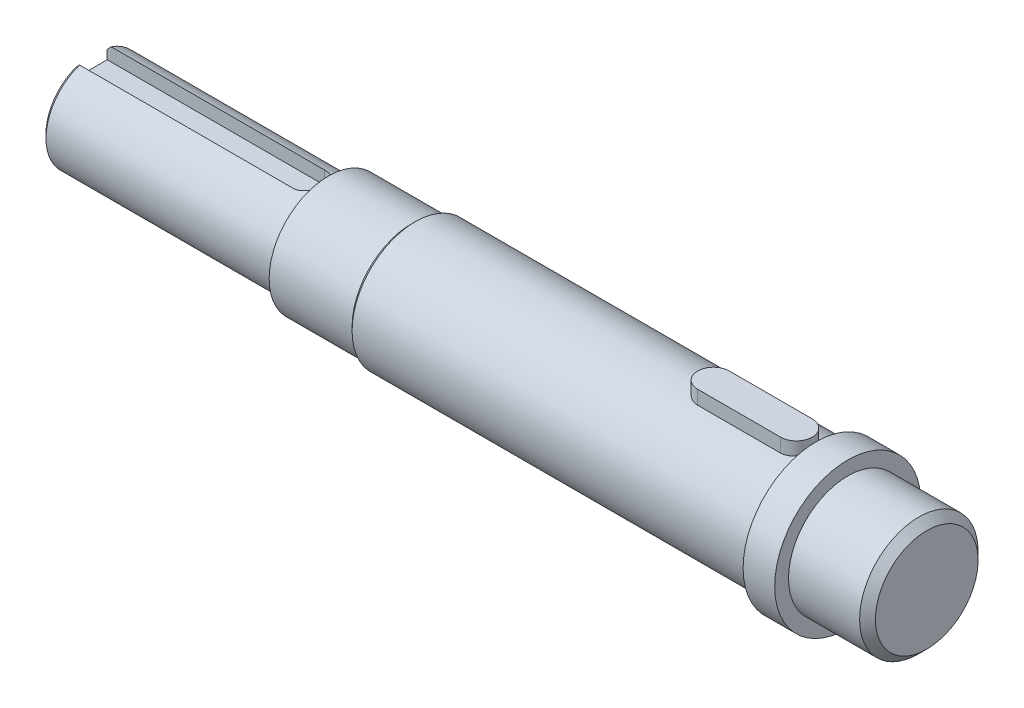
ISO-10303-21;
HEADER;
FILE_DESCRIPTION(('STEP AP214'),'2;1');
FILE_NAME('part.step','',(''),(''),'','','');
FILE_SCHEMA(('AUTOMOTIVE_DESIGN { 1 0 10303 214 1 1 1 1 }'));
ENDSEC;
DATA;
#1=APPLICATION_CONTEXT('core data for automotive mechanical design processes');
#2=APPLICATION_PROTOCOL_DEFINITION('international standard','automotive_design',2000,#1);
#3=PRODUCT_CONTEXT('',#1,'mechanical');
#4=PRODUCT('Part','Part','',(#3));
#5=PRODUCT_RELATED_PRODUCT_CATEGORY('part','',(#4));
#6=PRODUCT_DEFINITION_FORMATION('','',#4);
#7=PRODUCT_DEFINITION_CONTEXT('part definition',#1,'design');
#8=PRODUCT_DEFINITION('design','',#6,#7);
#9=PRODUCT_DEFINITION_SHAPE('','',#8);
#10=(LENGTH_UNIT() NAMED_UNIT(*) SI_UNIT(.MILLI.,.METRE.));
#11=(NAMED_UNIT(*) PLANE_ANGLE_UNIT() SI_UNIT($,.RADIAN.));
#12=(NAMED_UNIT(*) SI_UNIT($,.STERADIAN.) SOLID_ANGLE_UNIT());
#13=UNCERTAINTY_MEASURE_WITH_UNIT(LENGTH_MEASURE(1.E-05),#10,'distance_accuracy_value','');
#14=(GEOMETRIC_REPRESENTATION_CONTEXT(3) GLOBAL_UNCERTAINTY_ASSIGNED_CONTEXT((#13)) GLOBAL_UNIT_ASSIGNED_CONTEXT((#10,
#11,#12)) REPRESENTATION_CONTEXT('',''));
#15=CARTESIAN_POINT('',(0.,0.,0.));
#16=DIRECTION('',(0.,0.,1.));
#17=DIRECTION('',(1.,0.,0.));
#18=AXIS2_PLACEMENT_3D('',#15,#16,#17);
#19=CARTESIAN_POINT('',(83.4117628528477,19.,0.));
#20=DIRECTION('',(0.,-1.,0.));
#21=DIRECTION('',(0.,0.,-1.));
#22=AXIS2_PLACEMENT_3D('',#19,#20,#21);
#23=CYLINDRICAL_SURFACE('',#22,4.);
#24=CARTESIAN_POINT('',(83.4117628528477,11.,0.));
#25=DIRECTION('',(0.,1.,0.));
#26=DIRECTION('',(0.,0.,1.));
#27=AXIS2_PLACEMENT_3D('',#24,#25,#26);
#28=CIRCLE('',#27,4.);
#29=CARTESIAN_POINT('',(83.4117628528477,11.,-4.));
#30=VERTEX_POINT('',#29);
#31=CARTESIAN_POINT('',(83.4117628528477,11.,4.));
#32=VERTEX_POINT('',#31);
#33=EDGE_CURVE('E107',#30,#32,#28,.T.);
#34=ORIENTED_EDGE('',*,*,#33,.T.);
#35=DIRECTION('',(0.,-1.,0.));
#36=VECTOR('',#35,1.);
#37=CARTESIAN_POINT('',(83.4117628528477,19.,4.));
#38=LINE('',#37,#36);
#39=CARTESIAN_POINT('',(83.4117628528477,19.,4.));
#40=VERTEX_POINT('',#39);
#41=EDGE_CURVE('E12',#40,#32,#38,.T.);
#42=ORIENTED_EDGE('',*,*,#41,.F.);
#43=CARTESIAN_POINT('',(83.4117628528477,19.,0.));
#44=DIRECTION('',(0.,1.,0.));
#45=DIRECTION('',(0.,0.,1.));
#46=AXIS2_PLACEMENT_3D('',#43,#44,#45);
#47=CIRCLE('',#46,4.);
#48=CARTESIAN_POINT('',(83.4117628528477,19.,-4.));
#49=VERTEX_POINT('',#48);
#50=EDGE_CURVE('E95',#49,#40,#47,.T.);
#51=ORIENTED_EDGE('',*,*,#50,.F.);
#52=DIRECTION('',(0.,-1.,0.));
#53=VECTOR('',#52,1.);
#54=CARTESIAN_POINT('',(83.4117628528477,19.,-4.));
#55=LINE('',#54,#53);
#56=EDGE_CURVE('E103',#49,#30,#55,.T.);
#57=ORIENTED_EDGE('',*,*,#56,.T.);
#58=EDGE_LOOP('',(#34,#42,#51,#57));
#59=FACE_BOUND('',#58,.T.);
#60=ADVANCED_FACE('F44',(#59),#23,.T.);
#61=CARTESIAN_POINT('',(83.4117628528477,19.,4.));
#62=DIRECTION('',(0.,0.,-1.));
#63=DIRECTION('',(-1.,0.,0.));
#64=AXIS2_PLACEMENT_3D('',#61,#62,#63);
#65=PLANE('',#64);
#66=DIRECTION('',(1.,0.,0.));
#67=VECTOR('',#66,1.);
#68=CARTESIAN_POINT('',(83.4117628528477,11.,4.));
#69=LINE('',#68,#67);
#70=CARTESIAN_POINT('',(104.411762852848,11.,4.));
#71=VERTEX_POINT('',#70);
#72=EDGE_CURVE('E99',#32,#71,#69,.T.);
#73=ORIENTED_EDGE('',*,*,#72,.T.);
#74=DIRECTION('',(0.,-1.,0.));
#75=VECTOR('',#74,1.);
#76=CARTESIAN_POINT('',(104.411762852848,19.,4.));
#77=LINE('',#76,#75);
#78=CARTESIAN_POINT('',(104.411762852848,19.,4.));
#79=VERTEX_POINT('',#78);
#80=EDGE_CURVE('E52',#79,#71,#77,.T.);
#81=ORIENTED_EDGE('',*,*,#80,.F.);
#82=DIRECTION('',(1.,0.,0.));
#83=VECTOR('',#82,1.);
#84=CARTESIAN_POINT('',(83.4117628528477,19.,4.));
#85=LINE('',#84,#83);
#86=EDGE_CURVE('E90',#40,#79,#85,.T.);
#87=ORIENTED_EDGE('',*,*,#86,.F.);
#88=ORIENTED_EDGE('',*,*,#41,.T.);
#89=EDGE_LOOP('',(#73,#81,#87,#88));
#90=FACE_BOUND('',#89,.T.);
#91=ADVANCED_FACE('F98',(#90),#65,.F.);
#92=CARTESIAN_POINT('',(104.411762852848,19.,0.));
#93=DIRECTION('',(0.,-1.,0.));
#94=DIRECTION('',(0.,0.,-1.));
#95=AXIS2_PLACEMENT_3D('',#92,#93,#94);
#96=CYLINDRICAL_SURFACE('',#95,4.);
#97=CARTESIAN_POINT('',(104.411762852848,11.,0.));
#98=DIRECTION('',(0.,1.,0.));
#99=DIRECTION('',(0.,0.,1.));
#100=AXIS2_PLACEMENT_3D('',#97,#98,#99);
#101=CIRCLE('',#100,4.);
#102=CARTESIAN_POINT('',(104.411762852848,11.,-4.));
#103=VERTEX_POINT('',#102);
#104=EDGE_CURVE('E77',#71,#103,#101,.T.);
#105=ORIENTED_EDGE('',*,*,#104,.T.);
#106=DIRECTION('',(0.,-1.,0.));
#107=VECTOR('',#106,1.);
#108=CARTESIAN_POINT('',(104.411762852848,19.,-4.));
#109=LINE('',#108,#107);
#110=CARTESIAN_POINT('',(104.411762852848,19.,-4.));
#111=VERTEX_POINT('',#110);
#112=EDGE_CURVE('E100',#111,#103,#109,.T.);
#113=ORIENTED_EDGE('',*,*,#112,.F.);
#114=CARTESIAN_POINT('',(104.411762852848,19.,0.));
#115=DIRECTION('',(0.,1.,0.));
#116=DIRECTION('',(0.,0.,1.));
#117=AXIS2_PLACEMENT_3D('',#114,#115,#116);
#118=CIRCLE('',#117,4.);
#119=EDGE_CURVE('E93',#79,#111,#118,.T.);
#120=ORIENTED_EDGE('',*,*,#119,.F.);
#121=ORIENTED_EDGE('',*,*,#80,.T.);
#122=EDGE_LOOP('',(#105,#113,#120,#121));
#123=FACE_BOUND('',#122,.T.);
#124=ADVANCED_FACE('F101',(#123),#96,.T.);
#125=CARTESIAN_POINT('',(104.411762852848,19.,-4.));
#126=DIRECTION('',(0.,0.,1.));
#127=DIRECTION('',(1.,0.,0.));
#128=AXIS2_PLACEMENT_3D('',#125,#126,#127);
#129=PLANE('',#128);
#130=DIRECTION('',(-1.,0.,0.));
#131=VECTOR('',#130,1.);
#132=CARTESIAN_POINT('',(104.411762852848,11.,-4.));
#133=LINE('',#132,#131);
#134=EDGE_CURVE('E83',#103,#30,#133,.T.);
#135=ORIENTED_EDGE('',*,*,#134,.T.);
#136=ORIENTED_EDGE('',*,*,#56,.F.);
#137=DIRECTION('',(-1.,0.,0.));
#138=VECTOR('',#137,1.);
#139=CARTESIAN_POINT('',(104.411762852848,19.,-4.));
#140=LINE('',#139,#138);
#141=EDGE_CURVE('E60',#111,#49,#140,.T.);
#142=ORIENTED_EDGE('',*,*,#141,.F.);
#143=ORIENTED_EDGE('',*,*,#112,.T.);
#144=EDGE_LOOP('',(#135,#136,#142,#143));
#145=FACE_BOUND('',#144,.T.);
#146=ADVANCED_FACE('F114',(#145),#129,.F.);
#147=CARTESIAN_POINT('',(83.4117628528477,19.,0.));
#148=DIRECTION('',(0.,1.,0.));
#149=DIRECTION('',(0.,0.,1.));
#150=AXIS2_PLACEMENT_3D('',#147,#148,#149);
#151=PLANE('',#150);
#152=ORIENTED_EDGE('',*,*,#50,.T.);
#153=ORIENTED_EDGE('',*,*,#86,.T.);
#154=ORIENTED_EDGE('',*,*,#119,.T.);
#155=ORIENTED_EDGE('',*,*,#141,.T.);
#156=EDGE_LOOP('',(#152,#153,#154,#155));
#157=FACE_BOUND('',#156,.T.);
#158=ADVANCED_FACE('F91',(#157),#151,.T.);
#159=CARTESIAN_POINT('',(83.4117628528477,11.,0.));
#160=DIRECTION('',(0.,1.,0.));
#161=DIRECTION('',(0.,0.,1.));
#162=AXIS2_PLACEMENT_3D('',#159,#160,#161);
#163=PLANE('',#162);
#164=ORIENTED_EDGE('',*,*,#33,.F.);
#165=ORIENTED_EDGE('',*,*,#134,.F.);
#166=ORIENTED_EDGE('',*,*,#104,.F.);
#167=ORIENTED_EDGE('',*,*,#72,.F.);
#168=EDGE_LOOP('',(#164,#165,#166,#167));
#169=FACE_BOUND('',#168,.T.);
#170=ADVANCED_FACE('F117',(#169),#163,.F.);
#171=CLOSED_SHELL('',(#60,#91,#124,#146,#158,#170));
#172=MANIFOLD_SOLID_BREP('B2',#171);
#173=CARTESIAN_POINT('',(-74.0882371471523,0.,0.));
#174=DIRECTION('',(1.,0.,0.));
#175=DIRECTION('',(0.,0.,-1.));
#176=AXIS2_PLACEMENT_3D('',#173,#174,#175);
#177=PLANE('',#176);
#178=DIRECTION('',(0.,0.,1.));
#179=VECTOR('',#178,1.);
#180=CARTESIAN_POINT('',(-74.0882371471523,8.5,0.));
#181=LINE('',#180,#179);
#182=CARTESIAN_POINT('',(-74.0882371471523,8.5,-4.));
#183=VERTEX_POINT('',#182);
#184=CARTESIAN_POINT('',(-74.0882371471523,8.5,4.));
#185=VERTEX_POINT('',#184);
#186=EDGE_CURVE('E391',#183,#185,#181,.T.);
#187=ORIENTED_EDGE('',*,*,#186,.F.);
#188=DIRECTION('',(0.,1.,0.));
#189=VECTOR('',#188,1.);
#190=CARTESIAN_POINT('',(-74.0882371471523,0.,-4.));
#191=LINE('',#190,#189);
#192=CARTESIAN_POINT('',(-74.0882371471523,10.7819293264239,-4.));
#193=VERTEX_POINT('',#192);
#194=EDGE_CURVE('E430',#183,#193,#191,.T.);
#195=ORIENTED_EDGE('',*,*,#194,.T.);
#196=CARTESIAN_POINT('',(-74.0882371471523,0.,0.));
#197=DIRECTION('',(-1.,0.,0.));
#198=DIRECTION('',(0.,0.,1.));
#199=AXIS2_PLACEMENT_3D('',#196,#197,#198);
#200=CIRCLE('',#199,11.5);
#201=CARTESIAN_POINT('',(-74.0882371471523,10.7819293264239,4.));
#202=VERTEX_POINT('',#201);
#203=EDGE_CURVE('E400',#193,#202,#200,.T.);
#204=ORIENTED_EDGE('',*,*,#203,.T.);
#205=DIRECTION('',(0.,-1.,0.));
#206=VECTOR('',#205,1.);
#207=CARTESIAN_POINT('',(-74.0882371471523,0.,4.));
#208=LINE('',#207,#206);
#209=EDGE_CURVE('E438',#202,#185,#208,.T.);
#210=ORIENTED_EDGE('',*,*,#209,.T.);
#211=EDGE_LOOP('',(#187,#195,#204,#210));
#212=FACE_BOUND('',#211,.T.);
#213=ADVANCED_FACE('F167',(#212),#177,.F.);
#214=CARTESIAN_POINT('',(-73.0882371471523,0.,0.));
#215=DIRECTION('',(1.,0.,0.));
#216=DIRECTION('',(0.,0.,-1.));
#217=AXIS2_PLACEMENT_3D('',#214,#215,#216);
#218=CONICAL_SURFACE('',#217,12.5,0.785398163397448);
#219=ORIENTED_EDGE('',*,*,#203,.F.);
#220=CARTESIAN_POINT('',(-78.9331226805351,5.31888602658275,-4.));
#221=CARTESIAN_POINT('',(-78.8315416462131,5.44597256901755,-4.));
#222=CARTESIAN_POINT('',(-78.7291749070148,5.57242628773108,-4.));
#223=CARTESIAN_POINT('',(-78.5230906319077,5.82422188016957,-4.));
#224=CARTESIAN_POINT('',(-78.4193731404085,5.94956379022162,-4.));
#225=CARTESIAN_POINT('',(-78.106541919584,6.32413312006865,-4.));
#226=CARTESIAN_POINT('',(-77.8957234571059,6.57193643227893,-4.));
#227=CARTESIAN_POINT('',(-77.4708065656288,7.0645711080756,-4.));
#228=CARTESIAN_POINT('',(-77.2567091641703,7.30940336129174,-4.));
#229=CARTESIAN_POINT('',(-76.8259612743541,7.7968248335209,-4.));
#230=CARTESIAN_POINT('',(-76.6093106910457,8.0394139685117,-4.));
#231=CARTESIAN_POINT('',(-76.1741286826627,8.52270345641976,-4.));
#232=CARTESIAN_POINT('',(-75.9555981275249,8.76340459377775,-4.));
#233=CARTESIAN_POINT('',(-75.5169710180242,9.2433685239208,-4.));
#234=CARTESIAN_POINT('',(-75.2968744842313,9.4826313355232,-4.));
#235=CARTESIAN_POINT('',(-74.6346637851857,10.198724281731,-4.));
#236=CARTESIAN_POINT('',(-74.19066871892,10.6738145336964,-4.));
#237=CARTESIAN_POINT('',(-73.29952336028,11.6205786035658,-4.));
#238=CARTESIAN_POINT('',(-72.8523747223746,12.0922539829365,-4.));
#239=CARTESIAN_POINT('',(-71.9556886438244,13.0332926755318,-4.));
#240=CARTESIAN_POINT('',(-71.5061512952083,13.5026560765054,-4.));
#241=CARTESIAN_POINT('',(-70.6051521584602,14.4398591294602,-4.));
#242=CARTESIAN_POINT('',(-70.153689729611,14.9076981648611,-4.));
#243=CARTESIAN_POINT('',(-69.2493912921563,15.8420745176841,-4.));
#244=CARTESIAN_POINT('',(-68.7965552425573,16.3086117954434,-4.));
#245=CARTESIAN_POINT('',(-68.3432401343647,16.7746809797103,-4.));
#246=B_SPLINE_CURVE_WITH_KNOTS('',3,(#220,#221,#222,#223,#224,#225,#226,#227,#228,#229,#230,
#231,#232,#233,#234,#235,#236,#237,#238,#239,#240,#241,#242,#243,#244,#245),.UNSPECIFIED.,.F.,
.F.,(4,2,2,2,2,2,2,2,2,2,2,2,4),(0.,0.488076478608374,0.976136950691396,1.95213356534472,
2.92783034248739,3.90356352019565,4.87886717618535,5.85415804458109,7.80491943563012,
9.7547239729639,11.7044539279885,13.6548933201461,15.6053915045212),.UNSPECIFIED.);
#247=CARTESIAN_POINT('',(-73.0882371471523,11.842719282327,-4.));
#248=VERTEX_POINT('',#247);
#249=EDGE_CURVE('E433',#193,#248,#246,.T.);
#250=ORIENTED_EDGE('',*,*,#249,.T.);
#251=CARTESIAN_POINT('',(-73.0882371471523,0.,0.));
#252=DIRECTION('',(-1.,0.,0.));
#253=DIRECTION('',(0.,0.,1.));
#254=AXIS2_PLACEMENT_3D('',#251,#252,#253);
#255=CIRCLE('',#254,12.5);
#256=CARTESIAN_POINT('',(-73.0882371471523,11.842719282327,4.));
#257=VERTEX_POINT('',#256);
#258=EDGE_CURVE('E403',#248,#257,#255,.T.);
#259=ORIENTED_EDGE('',*,*,#258,.T.);
#260=CARTESIAN_POINT('',(-68.3432401343647,16.7746809797103,4.));
#261=CARTESIAN_POINT('',(-68.7965552425573,16.3086117954434,4.));
#262=CARTESIAN_POINT('',(-69.2493912921563,15.8420745176841,4.));
#263=CARTESIAN_POINT('',(-70.153689729611,14.9076981648611,4.));
#264=CARTESIAN_POINT('',(-70.6051521584602,14.4398591294602,4.));
#265=CARTESIAN_POINT('',(-71.5061512952083,13.5026560765054,4.));
#266=CARTESIAN_POINT('',(-71.9556886438244,13.0332926755318,4.));
#267=CARTESIAN_POINT('',(-72.8523747223747,12.0922539829365,4.));
#268=CARTESIAN_POINT('',(-73.2995233602801,11.6205786035658,4.));
#269=CARTESIAN_POINT('',(-74.1906687189201,10.6738145336965,4.));
#270=CARTESIAN_POINT('',(-74.6346637851856,10.198724281731,4.));
#271=CARTESIAN_POINT('',(-75.2968744842313,9.4826313355232,4.));
#272=CARTESIAN_POINT('',(-75.5169710180242,9.24336852392081,4.));
#273=CARTESIAN_POINT('',(-75.9555981275249,8.76340459377775,4.));
#274=CARTESIAN_POINT('',(-76.1741286826627,8.52270345641976,4.));
#275=CARTESIAN_POINT('',(-76.6093106910457,8.0394139685117,4.));
#276=CARTESIAN_POINT('',(-76.8259612743541,7.79682483352091,4.));
#277=CARTESIAN_POINT('',(-77.2567091641703,7.30940336129176,4.));
#278=CARTESIAN_POINT('',(-77.4708065656287,7.06457110807561,4.));
#279=CARTESIAN_POINT('',(-77.8957234571059,6.57193643227894,4.));
#280=CARTESIAN_POINT('',(-78.106541919584,6.32413312006867,4.));
#281=CARTESIAN_POINT('',(-78.4193731404085,5.94956379022162,4.));
#282=CARTESIAN_POINT('',(-78.5230906319077,5.82422188016957,4.));
#283=CARTESIAN_POINT('',(-78.7291749070148,5.57242628773107,4.));
#284=CARTESIAN_POINT('',(-78.831541646213,5.44597256901754,4.));
#285=CARTESIAN_POINT('',(-78.9331226805351,5.31888602658275,4.));
#286=B_SPLINE_CURVE_WITH_KNOTS('',3,(#260,#261,#262,#263,#264,#265,#266,#267,#268,#269,#270,
#271,#272,#273,#274,#275,#276,#277,#278,#279,#280,#281,#282,#283,#284,#285),.UNSPECIFIED.,.F.,
.F.,(4,2,2,2,2,2,2,2,2,2,2,2,4),(0.,1.95049818437511,3.90093757653268,5.85066753155728,
7.80047206889106,9.75123345994007,10.7265243283358,11.7018279843255,12.6775611620338,
13.6532579391764,14.6292545538298,15.1173150259128,15.6053915045212),.UNSPECIFIED.);
#287=EDGE_CURVE('E190',#257,#202,#286,.T.);
#288=ORIENTED_EDGE('',*,*,#287,.T.);
#289=EDGE_LOOP('',(#219,#250,#259,#288));
#290=FACE_BOUND('',#289,.T.);
#291=ADVANCED_FACE('F371',(#290),#218,.T.);
#292=CARTESIAN_POINT('',(-81.1442597325954,0.,0.));
#293=DIRECTION('',(-1.,0.,0.));
#294=DIRECTION('',(0.,0.,1.));
#295=AXIS2_PLACEMENT_3D('',#292,#293,#294);
#296=CYLINDRICAL_SURFACE('',#295,12.5);
#297=ORIENTED_EDGE('',*,*,#258,.F.);
#298=DIRECTION('',(-1.,0.,0.));
#299=VECTOR('',#298,1.);
#300=CARTESIAN_POINT('',(-81.1442597325954,11.842719282327,-4.));
#301=LINE('',#300,#299);
#302=CARTESIAN_POINT('',(-19.0882371471523,11.842719282327,-4.));
#303=VERTEX_POINT('',#302);
#304=EDGE_CURVE('E393',#248,#303,#301,.F.);
#305=ORIENTED_EDGE('',*,*,#304,.T.);
#306=CARTESIAN_POINT('',(-19.0882371471523,11.842719282327,-4.));
#307=CARTESIAN_POINT('',(-18.9788373751907,11.8427027366058,-4.00001410484613));
#308=CARTESIAN_POINT('',(-18.8694469373044,11.8442348052368,-3.995512175201));
#309=CARTESIAN_POINT('',(-18.6515089064158,11.8502730910574,-3.97758606678449));
#310=CARTESIAN_POINT('',(-18.5429611086678,11.8547785613244,-3.96416412872571));
#311=CARTESIAN_POINT('',(-18.3277761163068,11.8666242076309,-3.92855725119429));
#312=CARTESIAN_POINT('',(-18.2211344515411,11.8739564736691,-3.9063967602145));
#313=CARTESIAN_POINT('',(-18.0102315087807,11.8912164993788,-3.85353581488656));
#314=CARTESIAN_POINT('',(-17.9059703069955,11.90114434202,-3.82283508754056));
#315=CARTESIAN_POINT('',(-17.5979321428739,11.9343840843196,-3.71831764495512));
#316=CARTESIAN_POINT('',(-17.3986005950843,11.9611699822066,-3.63203544139887));
#317=CARTESIAN_POINT('',(-17.0172245901105,12.0209583955878,-3.42895021192288));
#318=CARTESIAN_POINT('',(-16.8351897681026,12.0539643457894,-3.31213030924909));
#319=CARTESIAN_POINT('',(-16.4869831585531,12.123798407807,-3.0467850788479));
#320=CARTESIAN_POINT('',(-16.3215188228128,12.1607158548651,-2.89735303896514));
#321=CARTESIAN_POINT('',(-16.0175222985634,12.2334561140966,-2.57296449846116));
#322=CARTESIAN_POINT('',(-15.8789947987946,12.2692787347869,-2.39800356343232));
#323=CARTESIAN_POINT('',(-15.6296219487817,12.3368244653945,-2.02237003010511));
#324=CARTESIAN_POINT('',(-15.5195151906827,12.3684294972003,-1.82118394546976));
#325=CARTESIAN_POINT('',(-15.3349876518029,12.4229251649937,-1.40197197350368));
#326=CARTESIAN_POINT('',(-15.2605566733704,12.4458182908278,-1.18395091903581));
#327=CARTESIAN_POINT('',(-15.1518782829018,12.4796767811416,-0.74471396106336));
#328=CARTESIAN_POINT('',(-15.1164122137722,12.4910030499338,-0.523827920101151));
#329=CARTESIAN_POINT('',(-15.0828043481107,12.5017287122873,-0.0789648151746338));
#330=CARTESIAN_POINT('',(-15.0846544136275,12.5011307063103,0.145011564197645));
#331=CARTESIAN_POINT('',(-15.1248359764236,12.4883236673358,0.581094974437695));
#332=CARTESIAN_POINT('',(-15.1618449151311,12.4765355800409,0.793338226675241));
#333=CARTESIAN_POINT('',(-15.2691176987586,12.443194578958,1.20842320012721));
#334=CARTESIAN_POINT('',(-15.3393833545851,12.4216411334261,1.41126440871778));
#335=CARTESIAN_POINT('',(-15.5119949893881,12.3706364987475,1.80478548808183));
#336=CARTESIAN_POINT('',(-15.6147336670211,12.3410893067347,1.99528012693527));
#337=CARTESIAN_POINT('',(-15.8490661961975,12.2771965403044,2.35673113106229));
#338=CARTESIAN_POINT('',(-15.9806673535553,12.2428497517893,2.52768253275751));
#339=CARTESIAN_POINT('',(-16.2756836784439,12.1712409097156,2.85304511528221));
#340=CARTESIAN_POINT('',(-16.4402338497444,12.1339170352569,3.00641313381737));
#341=CARTESIAN_POINT('',(-16.7932090472376,12.0618172896256,3.28377291775701));
#342=CARTESIAN_POINT('',(-16.9816414059845,12.0270422062066,3.40775562728566));
#343=CARTESIAN_POINT('',(-17.2796083849009,11.9796198433082,3.56958208232607));
#344=CARTESIAN_POINT('',(-17.3822362063938,11.9645161845072,3.61975674493765));
#345=CARTESIAN_POINT('',(-17.591641899904,11.9364591580623,3.71123075156255));
#346=CARTESIAN_POINT('',(-17.6984180349387,11.9235049021446,3.75253376401034));
#347=CARTESIAN_POINT('',(-17.9152504750439,11.9001802342949,3.82585831579179));
#348=CARTESIAN_POINT('',(-18.0253031251254,11.889807055759,3.85788979915529));
#349=CARTESIAN_POINT('',(-18.2479323040999,11.8719756673203,3.91241790563964));
#350=CARTESIAN_POINT('',(-18.3605076509497,11.8645161211931,3.93491889994975));
#351=CARTESIAN_POINT('',(-18.5754763930133,11.8533815888388,3.96832908530803));
#352=CARTESIAN_POINT('',(-18.6777045629469,11.8493925948395,3.9802038456482));
#353=CARTESIAN_POINT('',(-18.8826982251856,11.8440568016292,3.99603937127681));
#354=CARTESIAN_POINT('',(-18.9854627854328,11.8427063770563,4.00001099551563));
#355=CARTESIAN_POINT('',(-19.0882371471523,11.842719282327,4.));
#356=B_SPLINE_CURVE_WITH_KNOTS('',3,(#306,#307,#308,#309,#310,#311,#312,#313,#314,#315,#316,
#317,#318,#319,#320,#321,#322,#323,#324,#325,#326,#327,#328,#329,#330,#331,#332,#333,#334,#335,
#336,#337,#338,#339,#340,#341,#342,#343,#344,#345,#346,#347,#348,#349,#350,#351,#352,#353,#354,
#355),.UNSPECIFIED.,.F.,.F.,(4,2,2,2,2,2,2,2,2,2,2,2,2,2,2,2,2,2,2,2,2,2,2,2,4),(0.,
0.3280801769841,0.656077971124946,0.983164539368224,1.310261564488,1.96355293984248,
2.61720612481383,3.29209427898756,3.96709980211697,4.65819584662374,5.34909422856993,
6.01770820975086,6.68617638029994,7.3304550155383,7.97476873730065,8.6271932010581,
9.27978300073407,9.96076419384898,10.6419549776068,10.9872862883783,11.3324745283028,
11.6772911585126,12.0219494657669,12.3305938648259,12.6388138912331),.UNSPECIFIED.);
#357=CARTESIAN_POINT('',(-15.0882371471523,12.5,0.));
#358=VERTEX_POINT('',#357);
#359=EDGE_CURVE('E294',#303,#358,#356,.T.);
#360=ORIENTED_EDGE('',*,*,#359,.T.);
#361=CARTESIAN_POINT('',(-15.0882371471523,0.,0.));
#362=DIRECTION('',(-1.,0.,0.));
#363=DIRECTION('',(0.,0.,1.));
#364=AXIS2_PLACEMENT_3D('',#361,#362,#363);
#365=CIRCLE('',#364,12.5);
#366=EDGE_CURVE('E406',#358,#358,#365,.T.);
#367=ORIENTED_EDGE('',*,*,#366,.T.);
#368=CARTESIAN_POINT('',(-19.0882371471523,11.842719282327,4.));
#369=VERTEX_POINT('',#368);
#370=EDGE_CURVE('E284',#358,#369,#356,.T.);
#371=ORIENTED_EDGE('',*,*,#370,.T.);
#372=DIRECTION('',(-1.,0.,0.));
#373=VECTOR('',#372,1.);
#374=CARTESIAN_POINT('',(-81.1442597325954,11.842719282327,4.));
#375=LINE('',#374,#373);
#376=EDGE_CURVE('E398',#369,#257,#375,.T.);
#377=ORIENTED_EDGE('',*,*,#376,.T.);
#378=EDGE_LOOP('',(#297,#305,#360,#367,#371,#377));
#379=FACE_BOUND('',#378,.T.);
#380=ADVANCED_FACE('F301',(#379),#296,.T.);
#381=CARTESIAN_POINT('',(-14.0882371471523,0.,0.));
#382=DIRECTION('',(1.,0.,0.));
#383=DIRECTION('',(0.,0.,-1.));
#384=AXIS2_PLACEMENT_3D('',#381,#382,#383);
#385=CONICAL_SURFACE('',#384,13.5,0.785398163397448);
#386=ORIENTED_EDGE('',*,*,#366,.F.);
#387=EDGE_LOOP('',(#386));
#388=FACE_BOUND('',#387,.T.);
#389=CARTESIAN_POINT('',(-14.0882371471523,0.,0.));
#390=DIRECTION('',(-1.,0.,0.));
#391=DIRECTION('',(0.,0.,1.));
#392=AXIS2_PLACEMENT_3D('',#389,#390,#391);
#393=CIRCLE('',#392,13.5);
#394=CARTESIAN_POINT('',(-14.0882371471523,0.,13.5));
#395=VERTEX_POINT('',#394);
#396=EDGE_CURVE('E409',#395,#395,#393,.T.);
#397=ORIENTED_EDGE('',*,*,#396,.T.);
#398=EDGE_LOOP('',(#397));
#399=FACE_BOUND('',#398,.T.);
#400=ADVANCED_FACE('F450',(#388,#399),#385,.T.);
#401=CARTESIAN_POINT('',(-14.0882371471523,13.5,0.));
#402=DIRECTION('',(1.,0.,0.));
#403=DIRECTION('',(0.,0.,-1.));
#404=AXIS2_PLACEMENT_3D('',#401,#402,#403);
#405=PLANE('',#404);
#406=ORIENTED_EDGE('',*,*,#396,.F.);
#407=EDGE_LOOP('',(#406));
#408=FACE_BOUND('',#407,.T.);
#409=CARTESIAN_POINT('',(-14.0882371471523,0.,0.));
#410=DIRECTION('',(-1.,0.,0.));
#411=DIRECTION('',(0.,0.,1.));
#412=AXIS2_PLACEMENT_3D('',#409,#410,#411);
#413=CIRCLE('',#412,15.);
#414=CARTESIAN_POINT('',(-14.0882371471523,0.,15.));
#415=VERTEX_POINT('',#414);
#416=EDGE_CURVE('E412',#415,#415,#413,.T.);
#417=ORIENTED_EDGE('',*,*,#416,.T.);
#418=EDGE_LOOP('',(#417));
#419=FACE_BOUND('',#418,.T.);
#420=ADVANCED_FACE('F453',(#408,#419),#405,.F.);
#421=CARTESIAN_POINT('',(-81.1442597325954,0.,0.));
#422=DIRECTION('',(-1.,0.,0.));
#423=DIRECTION('',(0.,0.,1.));
#424=AXIS2_PLACEMENT_3D('',#421,#422,#423);
#425=CYLINDRICAL_SURFACE('',#424,15.);
#426=ORIENTED_EDGE('',*,*,#416,.F.);
#427=EDGE_LOOP('',(#426));
#428=FACE_BOUND('',#427,.T.);
#429=CARTESIAN_POINT('',(6.91176285284771,0.,0.));
#430=DIRECTION('',(-1.,0.,0.));
#431=DIRECTION('',(0.,0.,1.));
#432=AXIS2_PLACEMENT_3D('',#429,#430,#431);
#433=CIRCLE('',#432,15.);
#434=CARTESIAN_POINT('',(6.91176285284771,0.,15.));
#435=VERTEX_POINT('',#434);
#436=EDGE_CURVE('E415',#435,#435,#433,.T.);
#437=ORIENTED_EDGE('',*,*,#436,.T.);
#438=EDGE_LOOP('',(#437));
#439=FACE_BOUND('',#438,.T.);
#440=ADVANCED_FACE('F342',(#428,#439),#425,.T.);
#441=CARTESIAN_POINT('',(-81.1442597325954,0.,0.));
#442=DIRECTION('',(-1.,0.,0.));
#443=DIRECTION('',(0.,0.,1.));
#444=AXIS2_PLACEMENT_3D('',#441,#442,#443);
#445=CYLINDRICAL_SURFACE('',#444,16.);
#446=CARTESIAN_POINT('',(7.91176285284775,0.,0.));
#447=DIRECTION('',(1.,0.,0.));
#448=DIRECTION('',(0.,0.,-1.));
#449=AXIS2_PLACEMENT_3D('',#446,#447,#448);
#450=CIRCLE('',#449,16.);
#451=CARTESIAN_POINT('',(7.91176285284775,0.,-16.));
#452=VERTEX_POINT('',#451);
#453=EDGE_CURVE('E42',#452,#452,#450,.T.);
#454=ORIENTED_EDGE('',*,*,#453,.T.);
#455=EDGE_LOOP('',(#454));
#456=FACE_BOUND('',#455,.T.);
#457=DIRECTION('',(-1.,0.,0.));
#458=VECTOR('',#457,1.);
#459=CARTESIAN_POINT('',(-81.1442597325954,15.4919333848297,-4.));
#460=LINE('',#459,#458);
#461=CARTESIAN_POINT('',(83.4117628528477,15.4919333848297,-4.));
#462=VERTEX_POINT('',#461);
#463=CARTESIAN_POINT('',(104.411762852848,15.4919333848297,-4.));
#464=VERTEX_POINT('',#463);
#465=EDGE_CURVE('E175',#462,#464,#460,.F.);
#466=ORIENTED_EDGE('',*,*,#465,.T.);
#467=CARTESIAN_POINT('',(104.411762852848,15.4919333848297,-4.));
#468=CARTESIAN_POINT('',(104.522383309087,15.4919210257148,-4.00001281496977));
#469=CARTESIAN_POINT('',(104.632996164152,15.4931179394395,-3.99541136151182));
#470=CARTESIAN_POINT('',(104.853394732182,15.497838649108,-3.97707945053711));
#471=CARTESIAN_POINT('',(104.963180581189,15.5013620535051,-3.96335052916318));
#472=CARTESIAN_POINT('',(105.180935649807,15.5106349697307,-3.92689919473809));
#473=CARTESIAN_POINT('',(105.288908029801,15.5163800700024,-3.90419460243749));
#474=CARTESIAN_POINT('',(105.502464949344,15.5299147636492,-3.8500027840655));
#475=CARTESIAN_POINT('',(105.608049456035,15.5377043851402,-3.81851543721503));
#476=CARTESIAN_POINT('',(105.920098982601,15.5638139193468,-3.71122479245491));
#477=CARTESIAN_POINT('',(106.122078772596,15.5848845050093,-3.62255593345037));
#478=CARTESIAN_POINT('',(106.508252252238,15.6319661793202,-3.41365279801062));
#479=CARTESIAN_POINT('',(106.692441154384,15.6579785922507,-3.29341005728092));
#480=CARTESIAN_POINT('',(107.041926358318,15.7126502752341,-3.02194028985888));
#481=CARTESIAN_POINT('',(107.206779174847,15.7413515819965,-2.8701497192624));
#482=CARTESIAN_POINT('',(107.508974434276,15.7978042350173,-2.54110247783554));
#483=CARTESIAN_POINT('',(107.646312479747,15.8255554288412,-2.36384174410611));
#484=CARTESIAN_POINT('',(107.891405978177,15.8774472751679,-1.98582777383969));
#485=CARTESIAN_POINT('',(107.998722201653,15.9015321830017,-1.78478140886276));
#486=CARTESIAN_POINT('',(108.177862024718,15.9428938542902,-1.36681031585616));
#487=CARTESIAN_POINT('',(108.249692609492,15.9601719574972,-1.14988872245222));
#488=CARTESIAN_POINT('',(108.354398765716,15.9856759993143,-0.710976447699464));
#489=CARTESIAN_POINT('',(108.388033537594,15.9940781166206,-0.489177296245009));
#490=CARTESIAN_POINT('',(108.417776343965,16.0014975254641,-0.0429310944941722));
#491=CARTESIAN_POINT('',(108.413889095166,16.0005159965734,0.181515619447526));
#492=CARTESIAN_POINT('',(108.369243035703,15.9894094977236,0.621409952984795));
#493=CARTESIAN_POINT('',(108.329304539898,15.9794879587901,0.836946740055359));
#494=CARTESIAN_POINT('',(108.215007982662,15.9518532137637,1.25815491124439));
#495=CARTESIAN_POINT('',(108.14064839834,15.934139662931,1.46382585842471));
#496=CARTESIAN_POINT('',(107.958958311614,15.8925999545586,1.86162889311796));
#497=CARTESIAN_POINT('',(107.851335455992,15.8687199183383,2.05362157806833));
#498=CARTESIAN_POINT('',(107.606388153109,15.8174376564158,2.41710746540247));
#499=CARTESIAN_POINT('',(107.469059231183,15.7900349003342,2.58859757340647));
#500=CARTESIAN_POINT('',(107.164255564648,15.7338232745427,2.91107395301483));
#501=CARTESIAN_POINT('',(106.996067898416,15.7049964134931,3.06138278638948));
#502=CARTESIAN_POINT('',(106.636411784773,15.64984433632,3.33189193029686));
#503=CARTESIAN_POINT('',(106.444936985679,15.6235198062239,3.45208399884886));
#504=CARTESIAN_POINT('',(106.143864483025,15.588139423268,3.6073163656353));
#505=CARTESIAN_POINT('',(106.04084189688,15.5770011399579,3.65499741666694));
#506=CARTESIAN_POINT('',(105.830981842257,15.556455476374,3.74148006365296));
#507=CARTESIAN_POINT('',(105.72414591603,15.5470474056028,3.78028520334093));
#508=CARTESIAN_POINT('',(105.507533647287,15.5302627257633,3.84865934998258));
#509=CARTESIAN_POINT('',(105.397760478352,15.5228840141538,3.87823792052767));
#510=CARTESIAN_POINT('',(105.176014414229,15.5103783379237,3.92795371113847));
#511=CARTESIAN_POINT('',(105.064042575273,15.5052503184516,3.94809535439045));
#512=CARTESIAN_POINT('',(104.861956771828,15.4982157313273,3.97560964806634));
#513=CARTESIAN_POINT('',(104.772095751513,15.4958629734806,3.98475872120448));
#514=CARTESIAN_POINT('',(104.592080000755,15.4927204498778,3.99695146624015));
#515=CARTESIAN_POINT('',(104.501925983033,15.491928155377,4.00000501609602));
#516=CARTESIAN_POINT('',(104.411762852848,15.4919333848297,4.));
#517=B_SPLINE_CURVE_WITH_KNOTS('',3,(#467,#468,#469,#470,#471,#472,#473,#474,#475,#476,#477,
#478,#479,#480,#481,#482,#483,#484,#485,#486,#487,#488,#489,#490,#491,#492,#493,#494,#495,#496,
#497,#498,#499,#500,#501,#502,#503,#504,#505,#506,#507,#508,#509,#510,#511,#512,#513,#514,#515,
#516),.UNSPECIFIED.,.F.,.F.,(4,2,2,2,2,2,2,2,2,2,2,2,2,2,2,2,2,2,2,2,2,2,2,2,4),(0.,
0.331746121359091,0.663436424338612,0.994471453721361,1.32551103567064,1.98693231171535,
2.64853108225638,3.32315877306128,3.99789419750615,4.68203866727877,5.36604841264635,
6.03621044396236,6.70628823361493,7.3614930025204,8.0167267623829,8.67789156136443,
9.33915602192252,10.0182483647311,10.6975263505881,11.0393784167428,11.38109375829,
11.7224537164416,12.0636535151618,12.3345095624853,12.6049263228633),.UNSPECIFIED.);
#518=CARTESIAN_POINT('',(104.411762852848,15.4919333848297,4.));
#519=VERTEX_POINT('',#518);
#520=EDGE_CURVE('E347',#464,#519,#517,.T.);
#521=ORIENTED_EDGE('',*,*,#520,.T.);
#522=DIRECTION('',(-1.,0.,0.));
#523=VECTOR('',#522,1.);
#524=CARTESIAN_POINT('',(-81.1442597325954,15.4919333848297,4.));
#525=LINE('',#524,#523);
#526=CARTESIAN_POINT('',(83.4117628528477,15.4919333848297,4.));
#527=VERTEX_POINT('',#526);
#528=EDGE_CURVE('E359',#519,#527,#525,.T.);
#529=ORIENTED_EDGE('',*,*,#528,.T.);
#530=CARTESIAN_POINT('',(83.4117628528477,15.4919333848297,4.));
#531=CARTESIAN_POINT('',(83.3011423966083,15.4919210257148,4.00001281496977));
#532=CARTESIAN_POINT('',(83.1905295415437,15.4931179394395,3.99541136151182));
#533=CARTESIAN_POINT('',(82.970130973513,15.497838649108,3.97707945053711));
#534=CARTESIAN_POINT('',(82.8603451245066,15.5013620535051,3.96335052916318));
#535=CARTESIAN_POINT('',(82.6425900558884,15.5106349697307,3.92689919473809));
#536=CARTESIAN_POINT('',(82.5346176758948,15.5163800700024,3.90419460243749));
#537=CARTESIAN_POINT('',(82.3210607563513,15.5299147636492,3.85000278406549));
#538=CARTESIAN_POINT('',(82.2154762496607,15.5377043851402,3.81851543721503));
#539=CARTESIAN_POINT('',(81.9034267230941,15.5638139193468,3.71122479245491));
#540=CARTESIAN_POINT('',(81.7014469330993,15.5848845050093,3.62255593345036));
#541=CARTESIAN_POINT('',(81.315273453457,15.6319661793202,3.41365279801061));
#542=CARTESIAN_POINT('',(81.1310845513111,15.6579785922507,3.29341005728091));
#543=CARTESIAN_POINT('',(80.781599347377,15.7126502752341,3.02194028985888));
#544=CARTESIAN_POINT('',(80.6167465308488,15.7413515819965,2.8701497192624));
#545=CARTESIAN_POINT('',(80.314551271419,15.7978042350173,2.54110247783554));
#546=CARTESIAN_POINT('',(80.1772132259488,15.8255554288412,2.36384174410612));
#547=CARTESIAN_POINT('',(79.9321197275187,15.8774472751679,1.98582777383969));
#548=CARTESIAN_POINT('',(79.8248035040421,15.9015321830017,1.78478140886277));
#549=CARTESIAN_POINT('',(79.645663680977,15.9428938542902,1.36681031585616));
#550=CARTESIAN_POINT('',(79.5738330962037,15.9601719574972,1.14988872245222));
#551=CARTESIAN_POINT('',(79.4691269399792,15.9856759993143,0.710976447699465));
#552=CARTESIAN_POINT('',(79.4354921681012,15.9940781166206,0.489177296245009));
#553=CARTESIAN_POINT('',(79.4057493617303,16.0014975254641,0.042931094494172));
#554=CARTESIAN_POINT('',(79.4096366105293,16.0005159965734,-0.181515619447526));
#555=CARTESIAN_POINT('',(79.454282669992,15.9894094977236,-0.621409952984795));
#556=CARTESIAN_POINT('',(79.4942211657974,15.9794879587901,-0.836946740055359));
#557=CARTESIAN_POINT('',(79.6085177230337,15.9518532137637,-1.25815491124439));
#558=CARTESIAN_POINT('',(79.6828773073549,15.934139662931,-1.46382585842471));
#559=CARTESIAN_POINT('',(79.8645673940815,15.8925999545586,-1.86162889311796));
#560=CARTESIAN_POINT('',(79.9721902497032,15.8687199183383,-2.05362157806833));
#561=CARTESIAN_POINT('',(80.2171375525861,15.8174376564158,-2.41710746540247));
#562=CARTESIAN_POINT('',(80.3544664745119,15.7900349003342,-2.58859757340647));
#563=CARTESIAN_POINT('',(80.6592701410473,15.7338232745427,-2.91107395301483));
#564=CARTESIAN_POINT('',(80.8274578072795,15.7049964134931,-3.06138278638948));
#565=CARTESIAN_POINT('',(81.1871139209223,15.64984433632,-3.33189193029686));
#566=CARTESIAN_POINT('',(81.3785887200167,15.6235198062239,-3.45208399884886));
#567=CARTESIAN_POINT('',(81.6796612226706,15.588139423268,-3.60731636563531));
#568=CARTESIAN_POINT('',(81.7826838088155,15.5770011399579,-3.65499741666696));
#569=CARTESIAN_POINT('',(81.9925438634388,15.556455476374,-3.74148006365297));
#570=CARTESIAN_POINT('',(82.0993797896655,15.5470474056028,-3.78028520334093));
#571=CARTESIAN_POINT('',(82.3159920584084,15.5302627257633,-3.84865934998258));
#572=CARTESIAN_POINT('',(82.4257652273431,15.5228840141538,-3.87823792052767));
#573=CARTESIAN_POINT('',(82.6475112914665,15.5103783379237,-3.92795371113847));
#574=CARTESIAN_POINT('',(82.7594831304222,15.5052503184516,-3.94809535439045));
#575=CARTESIAN_POINT('',(82.9615689338673,15.4982157313273,-3.97560964806633));
#576=CARTESIAN_POINT('',(83.0514299541821,15.4958629734806,-3.98475872120447));
#577=CARTESIAN_POINT('',(83.2314457049405,15.4927204498778,-3.99695146624015));
#578=CARTESIAN_POINT('',(83.3215997226622,15.491928155377,-4.00000501609602));
#579=CARTESIAN_POINT('',(83.4117628528477,15.4919333848297,-4.));
#580=B_SPLINE_CURVE_WITH_KNOTS('',3,(#530,#531,#532,#533,#534,#535,#536,#537,#538,#539,#540,
#541,#542,#543,#544,#545,#546,#547,#548,#549,#550,#551,#552,#553,#554,#555,#556,#557,#558,#559,
#560,#561,#562,#563,#564,#565,#566,#567,#568,#569,#570,#571,#572,#573,#574,#575,#576,#577,#578,
#579),.UNSPECIFIED.,.F.,.F.,(4,2,2,2,2,2,2,2,2,2,2,2,2,2,2,2,2,2,2,2,2,2,2,2,4),(0.,
0.331746121359091,0.663436424338612,0.994471453721404,1.32551103567064,1.98693231171537,
2.64853108225638,3.32315877306128,3.99789419750615,4.68203866727876,5.36604841264635,
6.03621044396236,6.70628823361493,7.3614930025204,8.0167267623829,8.67789156136443,
9.33915602192252,10.0182483647311,10.6975263505881,11.0393784167429,11.38109375829,
11.7224537164416,12.0636535151618,12.3345095624852,12.6049263228633),.UNSPECIFIED.);
#581=EDGE_CURVE('E182',#527,#462,#580,.T.);
#582=ORIENTED_EDGE('',*,*,#581,.T.);
#583=EDGE_LOOP('',(#466,#521,#529,#582));
#584=FACE_BOUND('',#583,.T.);
#585=CARTESIAN_POINT('',(109.411762852848,0.,0.));
#586=DIRECTION('',(-1.,0.,0.));
#587=DIRECTION('',(0.,0.,1.));
#588=AXIS2_PLACEMENT_3D('',#585,#586,#587);
#589=CIRCLE('',#588,16.);
#590=CARTESIAN_POINT('',(109.411762852848,0.,16.));
#591=VERTEX_POINT('',#590);
#592=EDGE_CURVE('E418',#591,#591,#589,.T.);
#593=ORIENTED_EDGE('',*,*,#592,.T.);
#594=EDGE_LOOP('',(#593));
#595=FACE_BOUND('',#594,.T.);
#596=ADVANCED_FACE('F337',(#456,#584,#595),#445,.T.);
#597=CARTESIAN_POINT('',(109.411762852848,16.,0.));
#598=DIRECTION('',(1.,0.,0.));
#599=DIRECTION('',(0.,0.,-1.));
#600=AXIS2_PLACEMENT_3D('',#597,#598,#599);
#601=PLANE('',#600);
#602=ORIENTED_EDGE('',*,*,#592,.F.);
#603=EDGE_LOOP('',(#602));
#604=FACE_BOUND('',#603,.T.);
#605=CARTESIAN_POINT('',(109.411762852848,0.,0.));
#606=DIRECTION('',(-1.,0.,0.));
#607=DIRECTION('',(0.,0.,1.));
#608=AXIS2_PLACEMENT_3D('',#605,#606,#607);
#609=CIRCLE('',#608,18.5);
#610=CARTESIAN_POINT('',(109.411762852848,0.,18.5));
#611=VERTEX_POINT('',#610);
#612=EDGE_CURVE('E421',#611,#611,#609,.T.);
#613=ORIENTED_EDGE('',*,*,#612,.T.);
#614=EDGE_LOOP('',(#613));
#615=FACE_BOUND('',#614,.T.);
#616=ADVANCED_FACE('F333',(#604,#615),#601,.F.);
#617=CARTESIAN_POINT('',(-81.1442597325954,0.,0.));
#618=DIRECTION('',(-1.,0.,0.));
#619=DIRECTION('',(0.,0.,1.));
#620=AXIS2_PLACEMENT_3D('',#617,#618,#619);
#621=CYLINDRICAL_SURFACE('',#620,18.5);
#622=ORIENTED_EDGE('',*,*,#612,.F.);
#623=EDGE_LOOP('',(#622));
#624=FACE_BOUND('',#623,.T.);
#625=CARTESIAN_POINT('',(117.411762852848,0.,0.));
#626=DIRECTION('',(-1.,0.,0.));
#627=DIRECTION('',(0.,0.,1.));
#628=AXIS2_PLACEMENT_3D('',#625,#626,#627);
#629=CIRCLE('',#628,18.5);
#630=CARTESIAN_POINT('',(117.411762852848,0.,18.5));
#631=VERTEX_POINT('',#630);
#632=EDGE_CURVE('E424',#631,#631,#629,.T.);
#633=ORIENTED_EDGE('',*,*,#632,.T.);
#634=EDGE_LOOP('',(#633));
#635=FACE_BOUND('',#634,.T.);
#636=ADVANCED_FACE('F329',(#624,#635),#621,.T.);
#637=CARTESIAN_POINT('',(117.411762852848,18.5,0.));
#638=DIRECTION('',(-1.,0.,0.));
#639=DIRECTION('',(0.,0.,1.));
#640=AXIS2_PLACEMENT_3D('',#637,#638,#639);
#641=PLANE('',#640);
#642=ORIENTED_EDGE('',*,*,#632,.F.);
#643=EDGE_LOOP('',(#642));
#644=FACE_BOUND('',#643,.T.);
#645=CARTESIAN_POINT('',(117.411762852848,0.,0.));
#646=DIRECTION('',(-1.,0.,0.));
#647=DIRECTION('',(0.,0.,1.));
#648=AXIS2_PLACEMENT_3D('',#645,#646,#647);
#649=CIRCLE('',#648,15.);
#650=CARTESIAN_POINT('',(117.411762852848,0.,15.));
#651=VERTEX_POINT('',#650);
#652=EDGE_CURVE('E427',#651,#651,#649,.T.);
#653=ORIENTED_EDGE('',*,*,#652,.T.);
#654=EDGE_LOOP('',(#653));
#655=FACE_BOUND('',#654,.T.);
#656=ADVANCED_FACE('F325',(#644,#655),#641,.F.);
#657=CARTESIAN_POINT('',(-81.1442597325954,0.,0.));
#658=DIRECTION('',(-1.,0.,0.));
#659=DIRECTION('',(0.,0.,1.));
#660=AXIS2_PLACEMENT_3D('',#657,#658,#659);
#661=CYLINDRICAL_SURFACE('',#660,15.);
#662=CARTESIAN_POINT('',(135.411762852848,0.,0.));
#663=DIRECTION('',(-1.,0.,0.));
#664=DIRECTION('',(0.,0.,1.));
#665=AXIS2_PLACEMENT_3D('',#662,#663,#664);
#666=CIRCLE('',#665,15.);
#667=CARTESIAN_POINT('',(135.411762852848,0.,15.));
#668=VERTEX_POINT('',#667);
#669=EDGE_CURVE('E390',#668,#668,#666,.T.);
#670=ORIENTED_EDGE('',*,*,#669,.T.);
#671=EDGE_LOOP('',(#670));
#672=FACE_BOUND('',#671,.T.);
#673=ORIENTED_EDGE('',*,*,#652,.F.);
#674=EDGE_LOOP('',(#673));
#675=FACE_BOUND('',#674,.T.);
#676=ADVANCED_FACE('F321',(#672,#675),#661,.T.);
#677=CARTESIAN_POINT('',(137.411762852848,15.,0.));
#678=DIRECTION('',(-1.,0.,0.));
#679=DIRECTION('',(0.,0.,1.));
#680=AXIS2_PLACEMENT_3D('',#677,#678,#679);
#681=PLANE('',#680);
#682=CARTESIAN_POINT('',(137.411762852848,0.,0.));
#683=DIRECTION('',(-1.,0.,0.));
#684=DIRECTION('',(0.,0.,1.));
#685=AXIS2_PLACEMENT_3D('',#682,#683,#684);
#686=CIRCLE('',#685,13.);
#687=CARTESIAN_POINT('',(137.411762852848,0.,13.));
#688=VERTEX_POINT('',#687);
#689=EDGE_CURVE('E387',#688,#688,#686,.F.);
#690=ORIENTED_EDGE('',*,*,#689,.T.);
#691=EDGE_LOOP('',(#690));
#692=FACE_BOUND('',#691,.T.);
#693=ADVANCED_FACE('F317',(#692),#681,.F.);
#694=CARTESIAN_POINT('',(-74.7487283311019,8.5,0.));
#695=DIRECTION('',(0.,1.,0.));
#696=DIRECTION('',(0.,0.,1.));
#697=AXIS2_PLACEMENT_3D('',#694,#695,#696);
#698=PLANE('',#697);
#699=ORIENTED_EDGE('',*,*,#186,.T.);
#700=DIRECTION('',(1.,0.,0.));
#701=VECTOR('',#700,1.);
#702=CARTESIAN_POINT('',(-74.7487283311019,8.5,4.));
#703=LINE('',#702,#701);
#704=CARTESIAN_POINT('',(-19.0882371471523,8.5,4.));
#705=VERTEX_POINT('',#704);
#706=EDGE_CURVE('E268',#185,#705,#703,.T.);
#707=ORIENTED_EDGE('',*,*,#706,.T.);
#708=CARTESIAN_POINT('',(-19.0882371471523,8.5,0.));
#709=DIRECTION('',(0.,1.,0.));
#710=DIRECTION('',(0.,0.,1.));
#711=AXIS2_PLACEMENT_3D('',#708,#709,#710);
#712=CIRCLE('',#711,4.);
#713=CARTESIAN_POINT('',(-19.0882371471523,8.5,-4.));
#714=VERTEX_POINT('',#713);
#715=EDGE_CURVE('E274',#705,#714,#712,.T.);
#716=ORIENTED_EDGE('',*,*,#715,.T.);
#717=DIRECTION('',(-1.,0.,0.));
#718=VECTOR('',#717,1.);
#719=CARTESIAN_POINT('',(-74.7487283311019,8.5,-4.));
#720=LINE('',#719,#718);
#721=EDGE_CURVE('E277',#714,#183,#720,.T.);
#722=ORIENTED_EDGE('',*,*,#721,.T.);
#723=EDGE_LOOP('',(#699,#707,#716,#722));
#724=FACE_BOUND('',#723,.T.);
#725=ADVANCED_FACE('F320',(#724),#698,.T.);
#726=CARTESIAN_POINT('',(-74.7487283311019,8.5,-4.));
#727=DIRECTION('',(0.,0.,-1.));
#728=DIRECTION('',(-1.,0.,0.));
#729=AXIS2_PLACEMENT_3D('',#726,#727,#728);
#730=PLANE('',#729);
#731=ORIENTED_EDGE('',*,*,#721,.F.);
#732=DIRECTION('',(0.,1.,0.));
#733=VECTOR('',#732,1.);
#734=CARTESIAN_POINT('',(-19.0882371471523,8.5,-4.));
#735=LINE('',#734,#733);
#736=EDGE_CURVE('E281',#714,#303,#735,.T.);
#737=ORIENTED_EDGE('',*,*,#736,.T.);
#738=ORIENTED_EDGE('',*,*,#304,.F.);
#739=ORIENTED_EDGE('',*,*,#249,.F.);
#740=ORIENTED_EDGE('',*,*,#194,.F.);
#741=EDGE_LOOP('',(#731,#737,#738,#739,#740));
#742=FACE_BOUND('',#741,.T.);
#743=ADVANCED_FACE('F311',(#742),#730,.F.);
#744=CARTESIAN_POINT('',(-74.7487283311019,8.5,4.));
#745=DIRECTION('',(0.,0.,1.));
#746=DIRECTION('',(1.,0.,0.));
#747=AXIS2_PLACEMENT_3D('',#744,#745,#746);
#748=PLANE('',#747);
#749=ORIENTED_EDGE('',*,*,#287,.F.);
#750=ORIENTED_EDGE('',*,*,#376,.F.);
#751=DIRECTION('',(0.,1.,0.));
#752=VECTOR('',#751,1.);
#753=CARTESIAN_POINT('',(-19.0882371471523,8.5,4.));
#754=LINE('',#753,#752);
#755=EDGE_CURVE('E280',#705,#369,#754,.T.);
#756=ORIENTED_EDGE('',*,*,#755,.F.);
#757=ORIENTED_EDGE('',*,*,#706,.F.);
#758=ORIENTED_EDGE('',*,*,#209,.F.);
#759=EDGE_LOOP('',(#749,#750,#756,#757,#758));
#760=FACE_BOUND('',#759,.T.);
#761=ADVANCED_FACE('F309',(#760),#748,.F.);
#762=CARTESIAN_POINT('',(-19.0882371471523,8.5,0.));
#763=DIRECTION('',(0.,1.,0.));
#764=DIRECTION('',(0.,0.,1.));
#765=AXIS2_PLACEMENT_3D('',#762,#763,#764);
#766=CYLINDRICAL_SURFACE('',#765,4.);
#767=ORIENTED_EDGE('',*,*,#736,.F.);
#768=ORIENTED_EDGE('',*,*,#715,.F.);
#769=ORIENTED_EDGE('',*,*,#755,.T.);
#770=ORIENTED_EDGE('',*,*,#370,.F.);
#771=ORIENTED_EDGE('',*,*,#359,.F.);
#772=EDGE_LOOP('',(#767,#768,#769,#770,#771));
#773=FACE_BOUND('',#772,.T.);
#774=ADVANCED_FACE('F304',(#773),#766,.F.);
#775=CARTESIAN_POINT('',(135.411762852848,0.,0.));
#776=DIRECTION('',(-1.,0.,0.));
#777=DIRECTION('',(0.,0.,1.));
#778=AXIS2_PLACEMENT_3D('',#775,#776,#777);
#779=CONICAL_SURFACE('',#778,15.,0.785398163397452);
#780=ORIENTED_EDGE('',*,*,#689,.F.);
#781=EDGE_LOOP('',(#780));
#782=FACE_BOUND('',#781,.T.);
#783=ORIENTED_EDGE('',*,*,#669,.F.);
#784=EDGE_LOOP('',(#783));
#785=FACE_BOUND('',#784,.T.);
#786=ADVANCED_FACE('F308',(#782,#785),#779,.T.);
#787=CARTESIAN_POINT('',(83.4117628528477,11.,0.));
#788=DIRECTION('',(0.,1.,0.));
#789=DIRECTION('',(0.,0.,1.));
#790=AXIS2_PLACEMENT_3D('',#787,#788,#789);
#791=CYLINDRICAL_SURFACE('',#790,4.);
#792=DIRECTION('',(0.,1.,0.));
#793=VECTOR('',#792,1.);
#794=CARTESIAN_POINT('',(83.4117628528477,11.,4.));
#795=LINE('',#794,#793);
#796=CARTESIAN_POINT('',(83.4117628528477,11.,4.));
#797=VERTEX_POINT('',#796);
#798=EDGE_CURVE('E240',#797,#527,#795,.T.);
#799=ORIENTED_EDGE('',*,*,#798,.F.);
#800=CARTESIAN_POINT('',(83.4117628528477,11.,0.));
#801=DIRECTION('',(0.,1.,0.));
#802=DIRECTION('',(0.,0.,1.));
#803=AXIS2_PLACEMENT_3D('',#800,#801,#802);
#804=CIRCLE('',#803,4.);
#805=CARTESIAN_POINT('',(83.4117628528477,11.,-4.));
#806=VERTEX_POINT('',#805);
#807=EDGE_CURVE('E244',#806,#797,#804,.T.);
#808=ORIENTED_EDGE('',*,*,#807,.F.);
#809=DIRECTION('',(0.,1.,0.));
#810=VECTOR('',#809,1.);
#811=CARTESIAN_POINT('',(83.4117628528477,11.,-4.));
#812=LINE('',#811,#810);
#813=EDGE_CURVE('E266',#806,#462,#812,.T.);
#814=ORIENTED_EDGE('',*,*,#813,.T.);
#815=ORIENTED_EDGE('',*,*,#581,.F.);
#816=EDGE_LOOP('',(#799,#808,#814,#815));
#817=FACE_BOUND('',#816,.T.);
#818=ADVANCED_FACE('F242',(#817),#791,.F.);
#819=CARTESIAN_POINT('',(83.4117628528477,11.,-4.));
#820=DIRECTION('',(0.,0.,-1.));
#821=DIRECTION('',(-1.,0.,0.));
#822=AXIS2_PLACEMENT_3D('',#819,#820,#821);
#823=PLANE('',#822);
#824=ORIENTED_EDGE('',*,*,#813,.F.);
#825=DIRECTION('',(-1.,0.,0.));
#826=VECTOR('',#825,1.);
#827=CARTESIAN_POINT('',(83.4117628528477,11.,-4.));
#828=LINE('',#827,#826);
#829=CARTESIAN_POINT('',(104.411762852848,11.,-4.));
#830=VERTEX_POINT('',#829);
#831=EDGE_CURVE('E249',#830,#806,#828,.T.);
#832=ORIENTED_EDGE('',*,*,#831,.F.);
#833=DIRECTION('',(0.,1.,0.));
#834=VECTOR('',#833,1.);
#835=CARTESIAN_POINT('',(104.411762852848,11.,-4.));
#836=LINE('',#835,#834);
#837=EDGE_CURVE('E269',#830,#464,#836,.T.);
#838=ORIENTED_EDGE('',*,*,#837,.T.);
#839=ORIENTED_EDGE('',*,*,#465,.F.);
#840=EDGE_LOOP('',(#824,#832,#838,#839));
#841=FACE_BOUND('',#840,.T.);
#842=ADVANCED_FACE('F363',(#841),#823,.F.);
#843=CARTESIAN_POINT('',(104.411762852848,11.,0.));
#844=DIRECTION('',(0.,1.,0.));
#845=DIRECTION('',(0.,0.,1.));
#846=AXIS2_PLACEMENT_3D('',#843,#844,#845);
#847=CYLINDRICAL_SURFACE('',#846,4.);
#848=ORIENTED_EDGE('',*,*,#837,.F.);
#849=CARTESIAN_POINT('',(104.411762852848,11.,0.));
#850=DIRECTION('',(0.,1.,0.));
#851=DIRECTION('',(0.,0.,1.));
#852=AXIS2_PLACEMENT_3D('',#849,#850,#851);
#853=CIRCLE('',#852,4.);
#854=CARTESIAN_POINT('',(104.411762852848,11.,4.));
#855=VERTEX_POINT('',#854);
#856=EDGE_CURVE('E258',#855,#830,#853,.T.);
#857=ORIENTED_EDGE('',*,*,#856,.F.);
#858=DIRECTION('',(0.,1.,0.));
#859=VECTOR('',#858,1.);
#860=CARTESIAN_POINT('',(104.411762852848,11.,4.));
#861=LINE('',#860,#859);
#862=EDGE_CURVE('E248',#855,#519,#861,.T.);
#863=ORIENTED_EDGE('',*,*,#862,.T.);
#864=ORIENTED_EDGE('',*,*,#520,.F.);
#865=EDGE_LOOP('',(#848,#857,#863,#864));
#866=FACE_BOUND('',#865,.T.);
#867=ADVANCED_FACE('F485',(#866),#847,.F.);
#868=CARTESIAN_POINT('',(83.4117628528477,11.,4.));
#869=DIRECTION('',(0.,0.,1.));
#870=DIRECTION('',(1.,0.,0.));
#871=AXIS2_PLACEMENT_3D('',#868,#869,#870);
#872=PLANE('',#871);
#873=ORIENTED_EDGE('',*,*,#862,.F.);
#874=DIRECTION('',(1.,0.,0.));
#875=VECTOR('',#874,1.);
#876=CARTESIAN_POINT('',(83.4117628528477,11.,4.));
#877=LINE('',#876,#875);
#878=EDGE_CURVE('E252',#797,#855,#877,.T.);
#879=ORIENTED_EDGE('',*,*,#878,.F.);
#880=ORIENTED_EDGE('',*,*,#798,.T.);
#881=ORIENTED_EDGE('',*,*,#528,.F.);
#882=EDGE_LOOP('',(#873,#879,#880,#881));
#883=FACE_BOUND('',#882,.T.);
#884=ADVANCED_FACE('F253',(#883),#872,.F.);
#885=CARTESIAN_POINT('',(83.4117628528477,11.,0.));
#886=DIRECTION('',(0.,1.,0.));
#887=DIRECTION('',(0.,0.,1.));
#888=AXIS2_PLACEMENT_3D('',#885,#886,#887);
#889=PLANE('',#888);
#890=ORIENTED_EDGE('',*,*,#807,.T.);
#891=ORIENTED_EDGE('',*,*,#878,.T.);
#892=ORIENTED_EDGE('',*,*,#856,.T.);
#893=ORIENTED_EDGE('',*,*,#831,.T.);
#894=EDGE_LOOP('',(#890,#891,#892,#893));
#895=FACE_BOUND('',#894,.T.);
#896=ADVANCED_FACE('F260',(#895),#889,.T.);
#897=CARTESIAN_POINT('',(6.91176285284771,0.,0.));
#898=DIRECTION('',(1.,0.,0.));
#899=DIRECTION('',(0.,0.,-1.));
#900=AXIS2_PLACEMENT_3D('',#897,#898,#899);
#901=CONICAL_SURFACE('',#900,15.,0.785398163397448);
#902=ORIENTED_EDGE('',*,*,#453,.F.);
#903=EDGE_LOOP('',(#902));
#904=FACE_BOUND('',#903,.T.);
#905=ORIENTED_EDGE('',*,*,#436,.F.);
#906=EDGE_LOOP('',(#905));
#907=FACE_BOUND('',#906,.T.);
#908=ADVANCED_FACE('F169',(#904,#907),#901,.T.);
#909=CLOSED_SHELL('',(#213,#291,#380,#400,#420,#440,#596,#616,#636,#656,#676,#693,#725,#743,
#761,#774,#786,#818,#842,#867,#884,#896,#908));
#910=MANIFOLD_SOLID_BREP('B6',#909);
#911=ADVANCED_BREP_SHAPE_REPRESENTATION('',(#18,#172,#910),#14);
#912=SHAPE_DEFINITION_REPRESENTATION(#9,#911);
ENDSEC;
END-ISO-10303-21;
